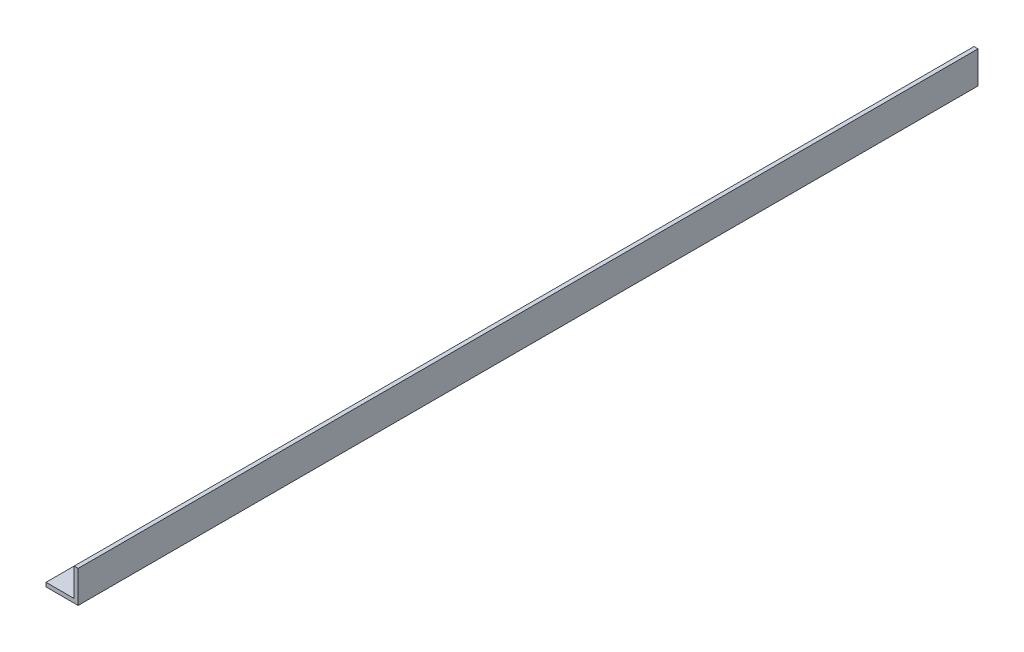
ISO-10303-21;
HEADER;
FILE_DESCRIPTION(('STEP AP214'),'2;1');
FILE_NAME('part.step','',(''),(''),'','','');
FILE_SCHEMA(('AUTOMOTIVE_DESIGN { 1 0 10303 214 1 1 1 1 }'));
ENDSEC;
DATA;
#1=APPLICATION_CONTEXT('core data for automotive mechanical design processes');
#2=APPLICATION_PROTOCOL_DEFINITION('international standard','automotive_design',2000,#1);
#3=PRODUCT_CONTEXT('',#1,'mechanical');
#4=PRODUCT('Part','Part','',(#3));
#5=PRODUCT_RELATED_PRODUCT_CATEGORY('part','',(#4));
#6=PRODUCT_DEFINITION_FORMATION('','',#4);
#7=PRODUCT_DEFINITION_CONTEXT('part definition',#1,'design');
#8=PRODUCT_DEFINITION('design','',#6,#7);
#9=PRODUCT_DEFINITION_SHAPE('','',#8);
#10=(LENGTH_UNIT() NAMED_UNIT(*) SI_UNIT(.MILLI.,.METRE.));
#11=(NAMED_UNIT(*) PLANE_ANGLE_UNIT() SI_UNIT($,.RADIAN.));
#12=(NAMED_UNIT(*) SI_UNIT($,.STERADIAN.) SOLID_ANGLE_UNIT());
#13=UNCERTAINTY_MEASURE_WITH_UNIT(LENGTH_MEASURE(1.E-05),#10,'distance_accuracy_value','');
#14=(GEOMETRIC_REPRESENTATION_CONTEXT(3) GLOBAL_UNCERTAINTY_ASSIGNED_CONTEXT((#13)) GLOBAL_UNIT_ASSIGNED_CONTEXT((#10,
#11,#12)) REPRESENTATION_CONTEXT('',''));
#15=CARTESIAN_POINT('',(0.,0.,0.));
#16=DIRECTION('',(0.,0.,1.));
#17=DIRECTION('',(1.,0.,0.));
#18=AXIS2_PLACEMENT_3D('',#15,#16,#17);
#19=CARTESIAN_POINT('',(0.,12.7,355.6));
#20=DIRECTION('',(-1.,0.,0.));
#21=DIRECTION('',(0.,-1.,0.));
#22=AXIS2_PLACEMENT_3D('',#19,#20,#21);
#23=PLANE('',#22);
#24=DIRECTION('',(0.,1.,0.));
#25=VECTOR('',#24,1.);
#26=CARTESIAN_POINT('',(0.,12.7,0.));
#27=LINE('',#26,#25);
#28=CARTESIAN_POINT('',(0.,0.,0.));
#29=VERTEX_POINT('',#28);
#30=CARTESIAN_POINT('',(0.,12.7,0.));
#31=VERTEX_POINT('',#30);
#32=EDGE_CURVE('E128',#29,#31,#27,.T.);
#33=ORIENTED_EDGE('',*,*,#32,.T.);
#34=DIRECTION('',(0.,0.,-1.));
#35=VECTOR('',#34,1.);
#36=CARTESIAN_POINT('',(0.,12.7,355.6));
#37=LINE('',#36,#35);
#38=CARTESIAN_POINT('',(0.,12.7,355.6));
#39=VERTEX_POINT('',#38);
#40=EDGE_CURVE('E11',#39,#31,#37,.T.);
#41=ORIENTED_EDGE('',*,*,#40,.F.);
#42=DIRECTION('',(0.,1.,0.));
#43=VECTOR('',#42,1.);
#44=CARTESIAN_POINT('',(0.,12.7,355.6));
#45=LINE('',#44,#43);
#46=CARTESIAN_POINT('',(0.,0.,355.6));
#47=VERTEX_POINT('',#46);
#48=EDGE_CURVE('E144',#47,#39,#45,.T.);
#49=ORIENTED_EDGE('',*,*,#48,.F.);
#50=DIRECTION('',(0.,0.,-1.));
#51=VECTOR('',#50,1.);
#52=CARTESIAN_POINT('',(0.,0.,355.6));
#53=LINE('',#52,#51);
#54=EDGE_CURVE('E124',#47,#29,#53,.T.);
#55=ORIENTED_EDGE('',*,*,#54,.T.);
#56=EDGE_LOOP('',(#33,#41,#49,#55));
#57=FACE_BOUND('',#56,.T.);
#58=ADVANCED_FACE('F39',(#57),#23,.F.);
#59=CARTESIAN_POINT('',(-1.5875,12.7,355.6));
#60=DIRECTION('',(0.,-1.,0.));
#61=DIRECTION('',(0.,0.,-1.));
#62=AXIS2_PLACEMENT_3D('',#59,#60,#61);
#63=PLANE('',#62);
#64=DIRECTION('',(-1.,0.,0.));
#65=VECTOR('',#64,1.);
#66=CARTESIAN_POINT('',(-1.5875,12.7,0.));
#67=LINE('',#66,#65);
#68=CARTESIAN_POINT('',(-1.5875,12.7,0.));
#69=VERTEX_POINT('',#68);
#70=EDGE_CURVE('E132',#31,#69,#67,.T.);
#71=ORIENTED_EDGE('',*,*,#70,.T.);
#72=DIRECTION('',(0.,0.,-1.));
#73=VECTOR('',#72,1.);
#74=CARTESIAN_POINT('',(-1.5875,12.7,355.6));
#75=LINE('',#74,#73);
#76=CARTESIAN_POINT('',(-1.5875,12.7,355.6));
#77=VERTEX_POINT('',#76);
#78=EDGE_CURVE('E48',#77,#69,#75,.T.);
#79=ORIENTED_EDGE('',*,*,#78,.F.);
#80=DIRECTION('',(-1.,0.,0.));
#81=VECTOR('',#80,1.);
#82=CARTESIAN_POINT('',(-1.5875,12.7,355.6));
#83=LINE('',#82,#81);
#84=EDGE_CURVE('E93',#39,#77,#83,.T.);
#85=ORIENTED_EDGE('',*,*,#84,.F.);
#86=ORIENTED_EDGE('',*,*,#40,.T.);
#87=EDGE_LOOP('',(#71,#79,#85,#86));
#88=FACE_BOUND('',#87,.T.);
#89=ADVANCED_FACE('F172',(#88),#63,.F.);
#90=CARTESIAN_POINT('',(-1.5875,1.5875,355.6));
#91=DIRECTION('',(1.,0.,0.));
#92=DIRECTION('',(0.,1.,0.));
#93=AXIS2_PLACEMENT_3D('',#90,#91,#92);
#94=PLANE('',#93);
#95=DIRECTION('',(0.,-1.,0.));
#96=VECTOR('',#95,1.);
#97=CARTESIAN_POINT('',(-1.5875,1.5875,0.));
#98=LINE('',#97,#96);
#99=CARTESIAN_POINT('',(-1.5875,1.5875,0.));
#100=VERTEX_POINT('',#99);
#101=EDGE_CURVE('E135',#69,#100,#98,.T.);
#102=ORIENTED_EDGE('',*,*,#101,.T.);
#103=DIRECTION('',(0.,0.,-1.));
#104=VECTOR('',#103,1.);
#105=CARTESIAN_POINT('',(-1.5875,1.5875,355.6));
#106=LINE('',#105,#104);
#107=CARTESIAN_POINT('',(-1.5875,1.5875,355.6));
#108=VERTEX_POINT('',#107);
#109=EDGE_CURVE('E117',#108,#100,#106,.T.);
#110=ORIENTED_EDGE('',*,*,#109,.F.);
#111=DIRECTION('',(0.,-1.,0.));
#112=VECTOR('',#111,1.);
#113=CARTESIAN_POINT('',(-1.5875,1.5875,355.6));
#114=LINE('',#113,#112);
#115=EDGE_CURVE('E106',#77,#108,#114,.T.);
#116=ORIENTED_EDGE('',*,*,#115,.F.);
#117=ORIENTED_EDGE('',*,*,#78,.T.);
#118=EDGE_LOOP('',(#102,#110,#116,#117));
#119=FACE_BOUND('',#118,.T.);
#120=ADVANCED_FACE('F154',(#119),#94,.F.);
#121=CARTESIAN_POINT('',(-12.7,1.5875,355.6));
#122=DIRECTION('',(0.,-1.,0.));
#123=DIRECTION('',(1.,0.,0.));
#124=AXIS2_PLACEMENT_3D('',#121,#122,#123);
#125=PLANE('',#124);
#126=DIRECTION('',(-1.,0.,0.));
#127=VECTOR('',#126,1.);
#128=CARTESIAN_POINT('',(-12.7,1.5875,0.));
#129=LINE('',#128,#127);
#130=CARTESIAN_POINT('',(-12.7,1.5875,0.));
#131=VERTEX_POINT('',#130);
#132=EDGE_CURVE('E115',#100,#131,#129,.T.);
#133=ORIENTED_EDGE('',*,*,#132,.T.);
#134=DIRECTION('',(0.,0.,-1.));
#135=VECTOR('',#134,1.);
#136=CARTESIAN_POINT('',(-12.7,1.5875,355.6));
#137=LINE('',#136,#135);
#138=CARTESIAN_POINT('',(-12.7,1.5875,355.6));
#139=VERTEX_POINT('',#138);
#140=EDGE_CURVE('E112',#139,#131,#137,.T.);
#141=ORIENTED_EDGE('',*,*,#140,.F.);
#142=DIRECTION('',(-1.,0.,0.));
#143=VECTOR('',#142,1.);
#144=CARTESIAN_POINT('',(-12.7,1.5875,355.6));
#145=LINE('',#144,#143);
#146=EDGE_CURVE('E100',#108,#139,#145,.T.);
#147=ORIENTED_EDGE('',*,*,#146,.F.);
#148=ORIENTED_EDGE('',*,*,#109,.T.);
#149=EDGE_LOOP('',(#133,#141,#147,#148));
#150=FACE_BOUND('',#149,.T.);
#151=ADVANCED_FACE('F113',(#150),#125,.F.);
#152=CARTESIAN_POINT('',(-12.7,0.,355.6));
#153=DIRECTION('',(1.,0.,0.));
#154=DIRECTION('',(0.,0.,-1.));
#155=AXIS2_PLACEMENT_3D('',#152,#153,#154);
#156=PLANE('',#155);
#157=DIRECTION('',(0.,-1.,0.));
#158=VECTOR('',#157,1.);
#159=CARTESIAN_POINT('',(-12.7,0.,0.));
#160=LINE('',#159,#158);
#161=CARTESIAN_POINT('',(-12.7,0.,0.));
#162=VERTEX_POINT('',#161);
#163=EDGE_CURVE('E79',#131,#162,#160,.T.);
#164=ORIENTED_EDGE('',*,*,#163,.T.);
#165=DIRECTION('',(0.,0.,-1.));
#166=VECTOR('',#165,1.);
#167=CARTESIAN_POINT('',(-12.7,0.,355.6));
#168=LINE('',#167,#166);
#169=CARTESIAN_POINT('',(-12.7,0.,355.6));
#170=VERTEX_POINT('',#169);
#171=EDGE_CURVE('E118',#170,#162,#168,.T.);
#172=ORIENTED_EDGE('',*,*,#171,.F.);
#173=DIRECTION('',(0.,-1.,0.));
#174=VECTOR('',#173,1.);
#175=CARTESIAN_POINT('',(-12.7,0.,355.6));
#176=LINE('',#175,#174);
#177=EDGE_CURVE('E104',#139,#170,#176,.T.);
#178=ORIENTED_EDGE('',*,*,#177,.F.);
#179=ORIENTED_EDGE('',*,*,#140,.T.);
#180=EDGE_LOOP('',(#164,#172,#178,#179));
#181=FACE_BOUND('',#180,.T.);
#182=ADVANCED_FACE('F120',(#181),#156,.F.);
#183=CARTESIAN_POINT('',(0.,0.,355.6));
#184=DIRECTION('',(0.,1.,0.));
#185=DIRECTION('',(-1.,0.,0.));
#186=AXIS2_PLACEMENT_3D('',#183,#184,#185);
#187=PLANE('',#186);
#188=DIRECTION('',(1.,0.,0.));
#189=VECTOR('',#188,1.);
#190=CARTESIAN_POINT('',(0.,0.,0.));
#191=LINE('',#190,#189);
#192=EDGE_CURVE('E85',#162,#29,#191,.T.);
#193=ORIENTED_EDGE('',*,*,#192,.T.);
#194=ORIENTED_EDGE('',*,*,#54,.F.);
#195=DIRECTION('',(1.,0.,0.));
#196=VECTOR('',#195,1.);
#197=CARTESIAN_POINT('',(0.,0.,355.6));
#198=LINE('',#197,#196);
#199=EDGE_CURVE('E56',#170,#47,#198,.T.);
#200=ORIENTED_EDGE('',*,*,#199,.F.);
#201=ORIENTED_EDGE('',*,*,#171,.T.);
#202=EDGE_LOOP('',(#193,#194,#200,#201));
#203=FACE_BOUND('',#202,.T.);
#204=ADVANCED_FACE('F161',(#203),#187,.F.);
#205=CARTESIAN_POINT('',(0.,0.,355.6));
#206=DIRECTION('',(0.,0.,-1.));
#207=DIRECTION('',(-1.,0.,0.));
#208=AXIS2_PLACEMENT_3D('',#205,#206,#207);
#209=PLANE('',#208);
#210=ORIENTED_EDGE('',*,*,#48,.T.);
#211=ORIENTED_EDGE('',*,*,#84,.T.);
#212=ORIENTED_EDGE('',*,*,#115,.T.);
#213=ORIENTED_EDGE('',*,*,#146,.T.);
#214=ORIENTED_EDGE('',*,*,#177,.T.);
#215=ORIENTED_EDGE('',*,*,#199,.T.);
#216=EDGE_LOOP('',(#210,#211,#212,#213,#214,#215));
#217=FACE_BOUND('',#216,.T.);
#218=ADVANCED_FACE('F102',(#217),#209,.F.);
#219=CARTESIAN_POINT('',(0.,0.,0.));
#220=DIRECTION('',(0.,0.,-1.));
#221=DIRECTION('',(-1.,0.,0.));
#222=AXIS2_PLACEMENT_3D('',#219,#220,#221);
#223=PLANE('',#222);
#224=ORIENTED_EDGE('',*,*,#32,.F.);
#225=ORIENTED_EDGE('',*,*,#192,.F.);
#226=ORIENTED_EDGE('',*,*,#163,.F.);
#227=ORIENTED_EDGE('',*,*,#132,.F.);
#228=ORIENTED_EDGE('',*,*,#101,.F.);
#229=ORIENTED_EDGE('',*,*,#70,.F.);
#230=EDGE_LOOP('',(#224,#225,#226,#227,#228,#229));
#231=FACE_BOUND('',#230,.T.);
#232=ADVANCED_FACE('F157',(#231),#223,.T.);
#233=CLOSED_SHELL('',(#58,#89,#120,#151,#182,#204,#218,#232));
#234=MANIFOLD_SOLID_BREP('B2',#233);
#235=ADVANCED_BREP_SHAPE_REPRESENTATION('',(#18,#234),#14);
#236=SHAPE_DEFINITION_REPRESENTATION(#9,#235);
ENDSEC;
END-ISO-10303-21;
